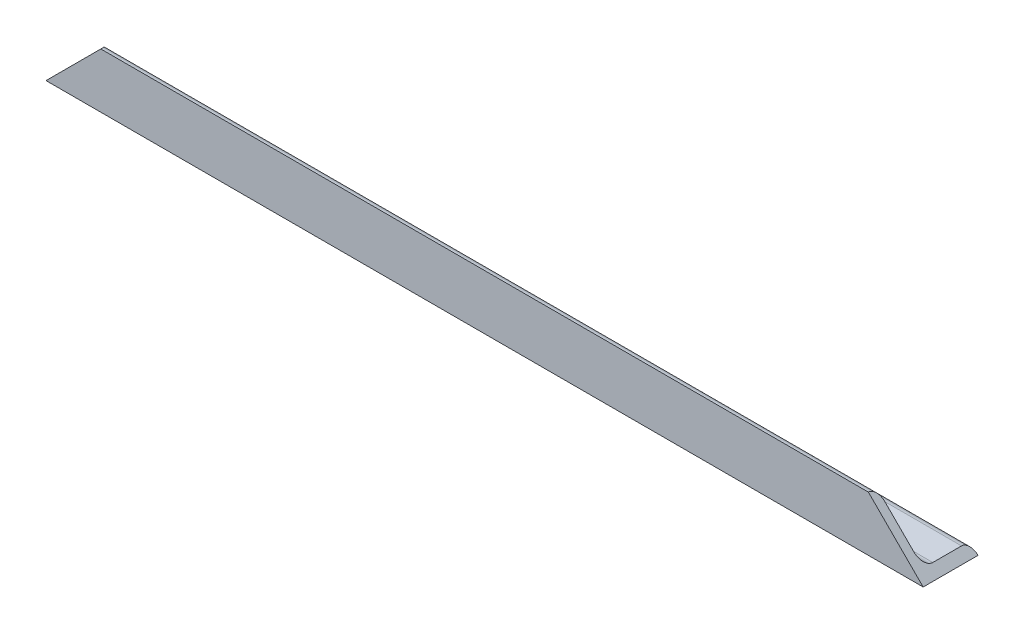
ISO-10303-21;
HEADER;
FILE_DESCRIPTION(('STEP AP214'),'2;1');
FILE_NAME('part.step','',(''),(''),'','','');
FILE_SCHEMA(('AUTOMOTIVE_DESIGN { 1 0 10303 214 1 1 1 1 }'));
ENDSEC;
DATA;
#1=APPLICATION_CONTEXT('core data for automotive mechanical design processes');
#2=APPLICATION_PROTOCOL_DEFINITION('international standard','automotive_design',2000,#1);
#3=PRODUCT_CONTEXT('',#1,'mechanical');
#4=PRODUCT('Part','Part','',(#3));
#5=PRODUCT_RELATED_PRODUCT_CATEGORY('part','',(#4));
#6=PRODUCT_DEFINITION_FORMATION('','',#4);
#7=PRODUCT_DEFINITION_CONTEXT('part definition',#1,'design');
#8=PRODUCT_DEFINITION('design','',#6,#7);
#9=PRODUCT_DEFINITION_SHAPE('','',#8);
#10=(LENGTH_UNIT() NAMED_UNIT(*) SI_UNIT(.MILLI.,.METRE.));
#11=(NAMED_UNIT(*) PLANE_ANGLE_UNIT() SI_UNIT($,.RADIAN.));
#12=(NAMED_UNIT(*) SI_UNIT($,.STERADIAN.) SOLID_ANGLE_UNIT());
#13=UNCERTAINTY_MEASURE_WITH_UNIT(LENGTH_MEASURE(1.E-05),#10,'distance_accuracy_value','');
#14=(GEOMETRIC_REPRESENTATION_CONTEXT(3) GLOBAL_UNCERTAINTY_ASSIGNED_CONTEXT((#13)) GLOBAL_UNIT_ASSIGNED_CONTEXT((#10,
#11,#12)) REPRESENTATION_CONTEXT('',''));
#15=CARTESIAN_POINT('',(0.,0.,0.));
#16=DIRECTION('',(0.,0.,1.));
#17=DIRECTION('',(1.,0.,0.));
#18=AXIS2_PLACEMENT_3D('',#15,#16,#17);
#19=CARTESIAN_POINT('',(320.,0.,-20.));
#20=DIRECTION('',(0.,1.,0.));
#21=DIRECTION('',(0.,0.,1.));
#22=AXIS2_PLACEMENT_3D('',#19,#20,#21);
#23=PLANE('',#22);
#24=DIRECTION('',(0.,0.,-1.));
#25=VECTOR('',#24,1.);
#26=CARTESIAN_POINT('',(0.,0.,-20.));
#27=LINE('',#26,#25);
#28=CARTESIAN_POINT('',(0.,0.,0.));
#29=VERTEX_POINT('',#28);
#30=CARTESIAN_POINT('',(0.,0.,-20.));
#31=VERTEX_POINT('',#30);
#32=EDGE_CURVE('E121',#29,#31,#27,.T.);
#33=ORIENTED_EDGE('',*,*,#32,.T.);
#34=DIRECTION('',(-1.,0.,0.));
#35=VECTOR('',#34,1.);
#36=CARTESIAN_POINT('',(320.,0.,-20.));
#37=LINE('',#36,#35);
#38=CARTESIAN_POINT('',(320.,0.,-20.));
#39=VERTEX_POINT('',#38);
#40=EDGE_CURVE('E13',#39,#31,#37,.T.);
#41=ORIENTED_EDGE('',*,*,#40,.F.);
#42=DIRECTION('',(0.,0.,-1.));
#43=VECTOR('',#42,1.);
#44=CARTESIAN_POINT('',(320.,0.,-20.));
#45=LINE('',#44,#43);
#46=CARTESIAN_POINT('',(320.,0.,0.));
#47=VERTEX_POINT('',#46);
#48=EDGE_CURVE('E132',#47,#39,#45,.T.);
#49=ORIENTED_EDGE('',*,*,#48,.F.);
#50=DIRECTION('',(-1.,0.,0.));
#51=VECTOR('',#50,1.);
#52=CARTESIAN_POINT('',(320.,0.,0.));
#53=LINE('',#52,#51);
#54=EDGE_CURVE('E138',#47,#29,#53,.T.);
#55=ORIENTED_EDGE('',*,*,#54,.T.);
#56=EDGE_LOOP('',(#33,#41,#49,#55));
#57=FACE_BOUND('',#56,.T.);
#58=ADVANCED_FACE('F67',(#57),#23,.F.);
#59=CARTESIAN_POINT('',(320.,0.,-17.));
#60=DIRECTION('',(-1.,0.,0.));
#61=DIRECTION('',(0.,0.,1.));
#62=AXIS2_PLACEMENT_3D('',#59,#60,#61);
#63=CYLINDRICAL_SURFACE('',#62,3.);
#64=ORIENTED_EDGE('',*,*,#40,.T.);
#65=CARTESIAN_POINT('',(0.,0.,-17.));
#66=DIRECTION('',(0.707106781186548,-0.707106781186548,0.));
#67=DIRECTION('',(-0.707106781186548,-0.707106781186548,0.));
#68=AXIS2_PLACEMENT_3D('',#65,#66,#67);
#69=ELLIPSE('',#68,4.24264068711928,3.);
#70=CARTESIAN_POINT('',(3.,3.,-17.));
#71=VERTEX_POINT('',#70);
#72=EDGE_CURVE('E127',#31,#71,#69,.T.);
#73=ORIENTED_EDGE('',*,*,#72,.T.);
#74=DIRECTION('',(-1.,0.,0.));
#75=VECTOR('',#74,1.);
#76=CARTESIAN_POINT('',(320.,3.,-17.));
#77=LINE('',#76,#75);
#78=CARTESIAN_POINT('',(317.,3.,-17.));
#79=VERTEX_POINT('',#78);
#80=EDGE_CURVE('E76',#79,#71,#77,.T.);
#81=ORIENTED_EDGE('',*,*,#80,.F.);
#82=CARTESIAN_POINT('',(320.,0.,-17.));
#83=DIRECTION('',(-0.707106781186548,-0.707106781186547,0.));
#84=DIRECTION('',(-0.707106781186547,0.707106781186548,0.));
#85=AXIS2_PLACEMENT_3D('',#82,#83,#84);
#86=ELLIPSE('',#85,4.24264068711928,3.);
#87=EDGE_CURVE('E133',#79,#39,#86,.T.);
#88=ORIENTED_EDGE('',*,*,#87,.T.);
#89=EDGE_LOOP('',(#64,#73,#81,#88));
#90=FACE_BOUND('',#89,.T.);
#91=ADVANCED_FACE('F175',(#90),#63,.T.);
#92=CARTESIAN_POINT('',(320.,3.,-6.5));
#93=DIRECTION('',(0.,-1.,0.));
#94=DIRECTION('',(0.,0.,-1.));
#95=AXIS2_PLACEMENT_3D('',#92,#93,#94);
#96=PLANE('',#95);
#97=ORIENTED_EDGE('',*,*,#80,.T.);
#98=DIRECTION('',(0.,0.,1.));
#99=VECTOR('',#98,1.);
#100=CARTESIAN_POINT('',(3.,3.,-6.5));
#101=LINE('',#100,#99);
#102=CARTESIAN_POINT('',(3.,3.,-6.5));
#103=VERTEX_POINT('',#102);
#104=EDGE_CURVE('E171',#71,#103,#101,.T.);
#105=ORIENTED_EDGE('',*,*,#104,.T.);
#106=DIRECTION('',(-1.,0.,0.));
#107=VECTOR('',#106,1.);
#108=CARTESIAN_POINT('',(320.,3.,-6.5));
#109=LINE('',#108,#107);
#110=CARTESIAN_POINT('',(317.,3.,-6.5));
#111=VERTEX_POINT('',#110);
#112=EDGE_CURVE('E160',#111,#103,#109,.T.);
#113=ORIENTED_EDGE('',*,*,#112,.F.);
#114=DIRECTION('',(0.,0.,-1.));
#115=VECTOR('',#114,1.);
#116=CARTESIAN_POINT('',(317.,3.,-6.5));
#117=LINE('',#116,#115);
#118=EDGE_CURVE('E172',#111,#79,#117,.T.);
#119=ORIENTED_EDGE('',*,*,#118,.T.);
#120=EDGE_LOOP('',(#97,#105,#113,#119));
#121=FACE_BOUND('',#120,.T.);
#122=ADVANCED_FACE('F169',(#121),#96,.F.);
#123=CARTESIAN_POINT('',(320.,6.5,-6.5));
#124=DIRECTION('',(-1.,0.,0.));
#125=DIRECTION('',(0.,0.,1.));
#126=AXIS2_PLACEMENT_3D('',#123,#124,#125);
#127=CYLINDRICAL_SURFACE('',#126,3.5);
#128=ORIENTED_EDGE('',*,*,#112,.T.);
#129=CARTESIAN_POINT('',(6.50000000000001,6.5,-6.5));
#130=DIRECTION('',(0.707106781186548,-0.707106781186548,0.));
#131=DIRECTION('',(-0.707106781186548,-0.707106781186548,0.));
#132=AXIS2_PLACEMENT_3D('',#129,#130,#131);
#133=ELLIPSE('',#132,4.94974746830583,3.5);
#134=CARTESIAN_POINT('',(6.50000000000009,6.50000000000001,-3.));
#135=VERTEX_POINT('',#134);
#136=EDGE_CURVE('E184',#103,#135,#133,.F.);
#137=ORIENTED_EDGE('',*,*,#136,.T.);
#138=DIRECTION('',(-1.,0.,0.));
#139=VECTOR('',#138,1.);
#140=CARTESIAN_POINT('',(320.,6.5,-3.));
#141=LINE('',#140,#139);
#142=CARTESIAN_POINT('',(313.5,6.5,-3.));
#143=VERTEX_POINT('',#142);
#144=EDGE_CURVE('E156',#143,#135,#141,.T.);
#145=ORIENTED_EDGE('',*,*,#144,.F.);
#146=CARTESIAN_POINT('',(313.5,6.5,-6.5));
#147=DIRECTION('',(-0.707106781186548,-0.707106781186547,0.));
#148=DIRECTION('',(-0.707106781186547,0.707106781186548,0.));
#149=AXIS2_PLACEMENT_3D('',#146,#147,#148);
#150=ELLIPSE('',#149,4.94974746830583,3.5);
#151=EDGE_CURVE('E191',#143,#111,#150,.F.);
#152=ORIENTED_EDGE('',*,*,#151,.T.);
#153=EDGE_LOOP('',(#128,#137,#145,#152));
#154=FACE_BOUND('',#153,.T.);
#155=ADVANCED_FACE('F200',(#154),#127,.F.);
#156=CARTESIAN_POINT('',(320.,17.,-3.));
#157=DIRECTION('',(0.,0.,1.));
#158=DIRECTION('',(0.,-1.,0.));
#159=AXIS2_PLACEMENT_3D('',#156,#157,#158);
#160=PLANE('',#159);
#161=ORIENTED_EDGE('',*,*,#144,.T.);
#162=DIRECTION('',(0.707106781186548,0.707106781186548,0.));
#163=VECTOR('',#162,1.);
#164=CARTESIAN_POINT('',(168.5,168.5,-3.00000000000001));
#165=LINE('',#164,#163);
#166=CARTESIAN_POINT('',(17.,17.,-3.));
#167=VERTEX_POINT('',#166);
#168=EDGE_CURVE('E207',#135,#167,#165,.T.);
#169=ORIENTED_EDGE('',*,*,#168,.T.);
#170=DIRECTION('',(-1.,0.,0.));
#171=VECTOR('',#170,1.);
#172=CARTESIAN_POINT('',(320.,17.,-3.));
#173=LINE('',#172,#171);
#174=CARTESIAN_POINT('',(303.,17.,-3.));
#175=VERTEX_POINT('',#174);
#176=EDGE_CURVE('E149',#175,#167,#173,.T.);
#177=ORIENTED_EDGE('',*,*,#176,.F.);
#178=DIRECTION('',(0.707106781186547,-0.707106781186548,0.));
#179=VECTOR('',#178,1.);
#180=CARTESIAN_POINT('',(311.5,8.50000000000002,-3.));
#181=LINE('',#180,#179);
#182=EDGE_CURVE('E182',#175,#143,#181,.T.);
#183=ORIENTED_EDGE('',*,*,#182,.T.);
#184=EDGE_LOOP('',(#161,#169,#177,#183));
#185=FACE_BOUND('',#184,.T.);
#186=ADVANCED_FACE('F205',(#185),#160,.F.);
#187=CARTESIAN_POINT('',(320.,17.,0.));
#188=DIRECTION('',(-1.,0.,0.));
#189=DIRECTION('',(0.,0.,1.));
#190=AXIS2_PLACEMENT_3D('',#187,#188,#189);
#191=CYLINDRICAL_SURFACE('',#190,3.);
#192=ORIENTED_EDGE('',*,*,#176,.T.);
#193=CARTESIAN_POINT('',(17.,17.,0.));
#194=DIRECTION('',(0.707106781186548,-0.707106781186548,0.));
#195=DIRECTION('',(-0.707106781186548,-0.707106781186548,0.));
#196=AXIS2_PLACEMENT_3D('',#193,#194,#195);
#197=ELLIPSE('',#196,4.24264068711928,3.);
#198=CARTESIAN_POINT('',(20.,20.,0.));
#199=VERTEX_POINT('',#198);
#200=EDGE_CURVE('E143',#167,#199,#197,.T.);
#201=ORIENTED_EDGE('',*,*,#200,.T.);
#202=DIRECTION('',(-1.,0.,0.));
#203=VECTOR('',#202,1.);
#204=CARTESIAN_POINT('',(320.,20.,0.));
#205=LINE('',#204,#203);
#206=CARTESIAN_POINT('',(300.,20.0000000000001,0.));
#207=VERTEX_POINT('',#206);
#208=EDGE_CURVE('E141',#207,#199,#205,.T.);
#209=ORIENTED_EDGE('',*,*,#208,.F.);
#210=CARTESIAN_POINT('',(303.,17.,0.));
#211=DIRECTION('',(-0.707106781186548,-0.707106781186547,0.));
#212=DIRECTION('',(-0.707106781186547,0.707106781186548,0.));
#213=AXIS2_PLACEMENT_3D('',#210,#211,#212);
#214=ELLIPSE('',#213,4.24264068711928,3.);
#215=EDGE_CURVE('E177',#207,#175,#214,.T.);
#216=ORIENTED_EDGE('',*,*,#215,.T.);
#217=EDGE_LOOP('',(#192,#201,#209,#216));
#218=FACE_BOUND('',#217,.T.);
#219=ADVANCED_FACE('F209',(#218),#191,.T.);
#220=CARTESIAN_POINT('',(320.,20.,0.));
#221=DIRECTION('',(0.,0.,-1.));
#222=DIRECTION('',(-1.,0.,0.));
#223=AXIS2_PLACEMENT_3D('',#220,#221,#222);
#224=PLANE('',#223);
#225=ORIENTED_EDGE('',*,*,#208,.T.);
#226=DIRECTION('',(0.707106781186548,0.707106781186548,0.));
#227=VECTOR('',#226,1.);
#228=CARTESIAN_POINT('',(20.,20.,0.));
#229=LINE('',#228,#227);
#230=EDGE_CURVE('E124',#29,#199,#229,.T.);
#231=ORIENTED_EDGE('',*,*,#230,.F.);
#232=ORIENTED_EDGE('',*,*,#54,.F.);
#233=DIRECTION('',(0.707106781186547,-0.707106781186548,0.));
#234=VECTOR('',#233,1.);
#235=CARTESIAN_POINT('',(300.,20.0000000000001,0.));
#236=LINE('',#235,#234);
#237=EDGE_CURVE('E82',#207,#47,#236,.T.);
#238=ORIENTED_EDGE('',*,*,#237,.F.);
#239=EDGE_LOOP('',(#225,#231,#232,#238));
#240=FACE_BOUND('',#239,.T.);
#241=ADVANCED_FACE('F137',(#240),#224,.F.);
#242=CARTESIAN_POINT('',(20.,20.,-20.));
#243=DIRECTION('',(0.707106781186548,-0.707106781186548,0.));
#244=DIRECTION('',(0.707106781186548,0.707106781186548,0.));
#245=AXIS2_PLACEMENT_3D('',#242,#243,#244);
#246=PLANE('',#245);
#247=ORIENTED_EDGE('',*,*,#32,.F.);
#248=ORIENTED_EDGE('',*,*,#230,.T.);
#249=ORIENTED_EDGE('',*,*,#200,.F.);
#250=ORIENTED_EDGE('',*,*,#168,.F.);
#251=ORIENTED_EDGE('',*,*,#136,.F.);
#252=ORIENTED_EDGE('',*,*,#104,.F.);
#253=ORIENTED_EDGE('',*,*,#72,.F.);
#254=EDGE_LOOP('',(#247,#248,#249,#250,#251,#252,#253));
#255=FACE_BOUND('',#254,.T.);
#256=ADVANCED_FACE('F123',(#255),#246,.F.);
#257=CARTESIAN_POINT('',(300.,20.0000000000001,-20.));
#258=DIRECTION('',(-0.707106781186548,-0.707106781186547,0.));
#259=DIRECTION('',(0.707106781186547,-0.707106781186548,0.));
#260=AXIS2_PLACEMENT_3D('',#257,#258,#259);
#261=PLANE('',#260);
#262=ORIENTED_EDGE('',*,*,#118,.F.);
#263=ORIENTED_EDGE('',*,*,#151,.F.);
#264=ORIENTED_EDGE('',*,*,#182,.F.);
#265=ORIENTED_EDGE('',*,*,#215,.F.);
#266=ORIENTED_EDGE('',*,*,#237,.T.);
#267=ORIENTED_EDGE('',*,*,#48,.T.);
#268=ORIENTED_EDGE('',*,*,#87,.F.);
#269=EDGE_LOOP('',(#262,#263,#264,#265,#266,#267,#268));
#270=FACE_BOUND('',#269,.T.);
#271=ADVANCED_FACE('F202',(#270),#261,.F.);
#272=CLOSED_SHELL('',(#58,#91,#122,#155,#186,#219,#241,#256,#271));
#273=MANIFOLD_SOLID_BREP('B2',#272);
#274=ADVANCED_BREP_SHAPE_REPRESENTATION('',(#18,#273),#14);
#275=SHAPE_DEFINITION_REPRESENTATION(#9,#274);
ENDSEC;
END-ISO-10303-21;
